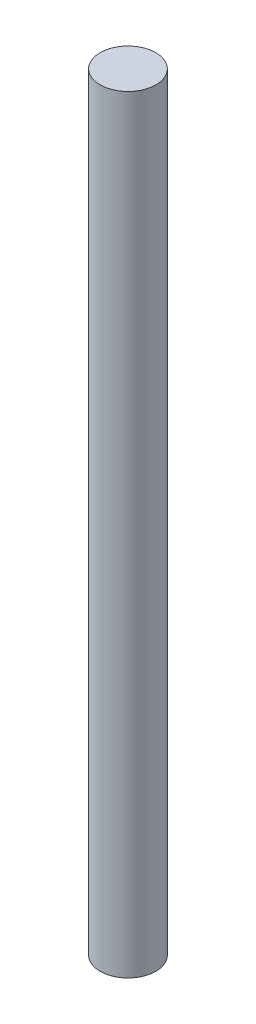
ISO-10303-21;
HEADER;
FILE_DESCRIPTION(('STEP AP214'),'2;1');
FILE_NAME('part.step','',(''),(''),'','','');
FILE_SCHEMA(('AUTOMOTIVE_DESIGN { 1 0 10303 214 1 1 1 1 }'));
ENDSEC;
DATA;
#1=APPLICATION_CONTEXT('core data for automotive mechanical design processes');
#2=APPLICATION_PROTOCOL_DEFINITION('international standard','automotive_design',2000,#1);
#3=PRODUCT_CONTEXT('',#1,'mechanical');
#4=PRODUCT('Part','Part','',(#3));
#5=PRODUCT_RELATED_PRODUCT_CATEGORY('part','',(#4));
#6=PRODUCT_DEFINITION_FORMATION('','',#4);
#7=PRODUCT_DEFINITION_CONTEXT('part definition',#1,'design');
#8=PRODUCT_DEFINITION('design','',#6,#7);
#9=PRODUCT_DEFINITION_SHAPE('','',#8);
#10=(LENGTH_UNIT() NAMED_UNIT(*) SI_UNIT(.MILLI.,.METRE.));
#11=(NAMED_UNIT(*) PLANE_ANGLE_UNIT() SI_UNIT($,.RADIAN.));
#12=(NAMED_UNIT(*) SI_UNIT($,.STERADIAN.) SOLID_ANGLE_UNIT());
#13=UNCERTAINTY_MEASURE_WITH_UNIT(LENGTH_MEASURE(1.E-05),#10,'distance_accuracy_value','');
#14=(GEOMETRIC_REPRESENTATION_CONTEXT(3) GLOBAL_UNCERTAINTY_ASSIGNED_CONTEXT((#13)) GLOBAL_UNIT_ASSIGNED_CONTEXT((#10,
#11,#12)) REPRESENTATION_CONTEXT('',''));
#15=CARTESIAN_POINT('',(0.,0.,0.));
#16=DIRECTION('',(0.,0.,1.));
#17=DIRECTION('',(1.,0.,0.));
#18=AXIS2_PLACEMENT_3D('',#15,#16,#17);
#19=CARTESIAN_POINT('',(0.,342.9,0.));
#20=DIRECTION('',(0.,-1.,0.));
#21=DIRECTION('',(0.,0.,-1.));
#22=AXIS2_PLACEMENT_3D('',#19,#20,#21);
#23=CYLINDRICAL_SURFACE('',#22,12.446);
#24=CARTESIAN_POINT('',(0.,342.9,0.));
#25=DIRECTION('',(0.,1.,0.));
#26=DIRECTION('',(0.,0.,1.));
#27=AXIS2_PLACEMENT_3D('',#24,#25,#26);
#28=CIRCLE('',#27,12.446);
#29=CARTESIAN_POINT('',(0.,342.9,12.446));
#30=VERTEX_POINT('',#29);
#31=EDGE_CURVE('E10',#30,#30,#28,.T.);
#32=ORIENTED_EDGE('',*,*,#31,.F.);
#33=EDGE_LOOP('',(#32));
#34=FACE_BOUND('',#33,.T.);
#35=CARTESIAN_POINT('',(0.,0.,0.));
#36=DIRECTION('',(0.,1.,0.));
#37=DIRECTION('',(0.,0.,1.));
#38=AXIS2_PLACEMENT_3D('',#35,#36,#37);
#39=CIRCLE('',#38,12.446);
#40=CARTESIAN_POINT('',(0.,0.,12.446));
#41=VERTEX_POINT('',#40);
#42=EDGE_CURVE('E40',#41,#41,#39,.T.);
#43=ORIENTED_EDGE('',*,*,#42,.T.);
#44=EDGE_LOOP('',(#43));
#45=FACE_BOUND('',#44,.T.);
#46=ADVANCED_FACE('F37',(#34,#45),#23,.T.);
#47=CARTESIAN_POINT('',(0.,342.9,0.));
#48=DIRECTION('',(0.,1.,0.));
#49=DIRECTION('',(0.,0.,1.));
#50=AXIS2_PLACEMENT_3D('',#47,#48,#49);
#51=PLANE('',#50);
#52=ORIENTED_EDGE('',*,*,#31,.T.);
#53=EDGE_LOOP('',(#52));
#54=FACE_BOUND('',#53,.T.);
#55=ADVANCED_FACE('F54',(#54),#51,.T.);
#56=CARTESIAN_POINT('',(0.,0.,0.));
#57=DIRECTION('',(0.,1.,0.));
#58=DIRECTION('',(0.,0.,1.));
#59=AXIS2_PLACEMENT_3D('',#56,#57,#58);
#60=PLANE('',#59);
#61=ORIENTED_EDGE('',*,*,#42,.F.);
#62=EDGE_LOOP('',(#61));
#63=FACE_BOUND('',#62,.T.);
#64=ADVANCED_FACE('F52',(#63),#60,.F.);
#65=CLOSED_SHELL('',(#46,#55,#64));
#66=MANIFOLD_SOLID_BREP('B2',#65);
#67=ADVANCED_BREP_SHAPE_REPRESENTATION('',(#18,#66),#14);
#68=SHAPE_DEFINITION_REPRESENTATION(#9,#67);
ENDSEC;
END-ISO-10303-21;
